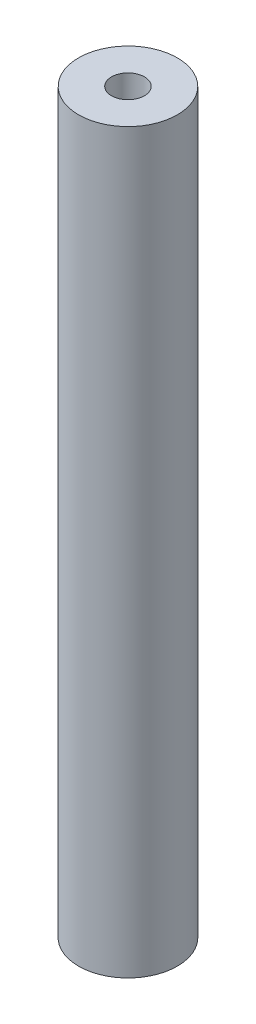
ISO-10303-21;
HEADER;
FILE_DESCRIPTION(('STEP AP214'),'2;1');
FILE_NAME('part.step','',(''),(''),'','','');
FILE_SCHEMA(('AUTOMOTIVE_DESIGN { 1 0 10303 214 1 1 1 1 }'));
ENDSEC;
DATA;
#1=APPLICATION_CONTEXT('core data for automotive mechanical design processes');
#2=APPLICATION_PROTOCOL_DEFINITION('international standard','automotive_design',2000,#1);
#3=PRODUCT_CONTEXT('',#1,'mechanical');
#4=PRODUCT('Part','Part','',(#3));
#5=PRODUCT_RELATED_PRODUCT_CATEGORY('part','',(#4));
#6=PRODUCT_DEFINITION_FORMATION('','',#4);
#7=PRODUCT_DEFINITION_CONTEXT('part definition',#1,'design');
#8=PRODUCT_DEFINITION('design','',#6,#7);
#9=PRODUCT_DEFINITION_SHAPE('','',#8);
#10=(LENGTH_UNIT() NAMED_UNIT(*) SI_UNIT(.MILLI.,.METRE.));
#11=(NAMED_UNIT(*) PLANE_ANGLE_UNIT() SI_UNIT($,.RADIAN.));
#12=(NAMED_UNIT(*) SI_UNIT($,.STERADIAN.) SOLID_ANGLE_UNIT());
#13=UNCERTAINTY_MEASURE_WITH_UNIT(LENGTH_MEASURE(1.E-05),#10,'distance_accuracy_value','');
#14=(GEOMETRIC_REPRESENTATION_CONTEXT(3) GLOBAL_UNCERTAINTY_ASSIGNED_CONTEXT((#13)) GLOBAL_UNIT_ASSIGNED_CONTEXT((#10,
#11,#12)) REPRESENTATION_CONTEXT('',''));
#15=CARTESIAN_POINT('',(0.,0.,0.));
#16=DIRECTION('',(0.,0.,1.));
#17=DIRECTION('',(1.,0.,0.));
#18=AXIS2_PLACEMENT_3D('',#15,#16,#17);
#19=CARTESIAN_POINT('',(0.,355.6,0.));
#20=DIRECTION('',(0.,1.,0.));
#21=DIRECTION('',(0.,0.,1.));
#22=AXIS2_PLACEMENT_3D('',#19,#20,#21);
#23=PLANE('',#22);
#24=CARTESIAN_POINT('',(0.,355.6,0.));
#25=DIRECTION('',(0.,1.,0.));
#26=DIRECTION('',(0.,0.,1.));
#27=AXIS2_PLACEMENT_3D('',#24,#25,#26);
#28=CIRCLE('',#27,47.625);
#29=CARTESIAN_POINT('',(0.,355.6,47.625));
#30=VERTEX_POINT('',#29);
#31=EDGE_CURVE('E10',#30,#30,#28,.T.);
#32=ORIENTED_EDGE('',*,*,#31,.T.);
#33=EDGE_LOOP('',(#32));
#34=FACE_BOUND('',#33,.T.);
#35=CARTESIAN_POINT('',(0.,355.6,0.));
#36=DIRECTION('',(0.,1.,0.));
#37=DIRECTION('',(0.,0.,1.));
#38=AXIS2_PLACEMENT_3D('',#35,#36,#37);
#39=CIRCLE('',#38,15.875);
#40=CARTESIAN_POINT('',(0.,355.6,15.875));
#41=VERTEX_POINT('',#40);
#42=EDGE_CURVE('E50',#41,#41,#39,.T.);
#43=ORIENTED_EDGE('',*,*,#42,.F.);
#44=EDGE_LOOP('',(#43));
#45=FACE_BOUND('',#44,.T.);
#46=ADVANCED_FACE('F37',(#34,#45),#23,.T.);
#47=CARTESIAN_POINT('',(0.,-355.6,0.));
#48=DIRECTION('',(0.,1.,0.));
#49=DIRECTION('',(0.,0.,1.));
#50=AXIS2_PLACEMENT_3D('',#47,#48,#49);
#51=PLANE('',#50);
#52=CARTESIAN_POINT('',(0.,-355.6,0.));
#53=DIRECTION('',(0.,1.,0.));
#54=DIRECTION('',(0.,0.,1.));
#55=AXIS2_PLACEMENT_3D('',#52,#53,#54);
#56=CIRCLE('',#55,47.625);
#57=CARTESIAN_POINT('',(0.,-355.6,47.625));
#58=VERTEX_POINT('',#57);
#59=EDGE_CURVE('E41',#58,#58,#56,.T.);
#60=ORIENTED_EDGE('',*,*,#59,.F.);
#61=EDGE_LOOP('',(#60));
#62=FACE_BOUND('',#61,.T.);
#63=CARTESIAN_POINT('',(0.,-355.6,0.));
#64=DIRECTION('',(0.,1.,0.));
#65=DIRECTION('',(0.,0.,1.));
#66=AXIS2_PLACEMENT_3D('',#63,#64,#65);
#67=CIRCLE('',#66,15.875);
#68=CARTESIAN_POINT('',(0.,-355.6,15.875));
#69=VERTEX_POINT('',#68);
#70=EDGE_CURVE('E52',#69,#69,#67,.T.);
#71=ORIENTED_EDGE('',*,*,#70,.T.);
#72=EDGE_LOOP('',(#71));
#73=FACE_BOUND('',#72,.T.);
#74=ADVANCED_FACE('F64',(#62,#73),#51,.F.);
#75=CARTESIAN_POINT('',(0.,355.6,0.));
#76=DIRECTION('',(0.,-1.,0.));
#77=DIRECTION('',(0.,0.,-1.));
#78=AXIS2_PLACEMENT_3D('',#75,#76,#77);
#79=CYLINDRICAL_SURFACE('',#78,47.625);
#80=ORIENTED_EDGE('',*,*,#31,.F.);
#81=EDGE_LOOP('',(#80));
#82=FACE_BOUND('',#81,.T.);
#83=ORIENTED_EDGE('',*,*,#59,.T.);
#84=EDGE_LOOP('',(#83));
#85=FACE_BOUND('',#84,.T.);
#86=ADVANCED_FACE('F39',(#82,#85),#79,.T.);
#87=CARTESIAN_POINT('',(0.,355.6,0.));
#88=DIRECTION('',(0.,-1.,0.));
#89=DIRECTION('',(0.,0.,-1.));
#90=AXIS2_PLACEMENT_3D('',#87,#88,#89);
#91=CYLINDRICAL_SURFACE('',#90,15.875);
#92=ORIENTED_EDGE('',*,*,#42,.T.);
#93=EDGE_LOOP('',(#92));
#94=FACE_BOUND('',#93,.T.);
#95=ORIENTED_EDGE('',*,*,#70,.F.);
#96=EDGE_LOOP('',(#95));
#97=FACE_BOUND('',#96,.T.);
#98=ADVANCED_FACE('F60',(#94,#97),#91,.F.);
#99=CLOSED_SHELL('',(#46,#74,#86,#98));
#100=MANIFOLD_SOLID_BREP('B2',#99);
#101=ADVANCED_BREP_SHAPE_REPRESENTATION('',(#18,#100),#14);
#102=SHAPE_DEFINITION_REPRESENTATION(#9,#101);
ENDSEC;
END-ISO-10303-21;
